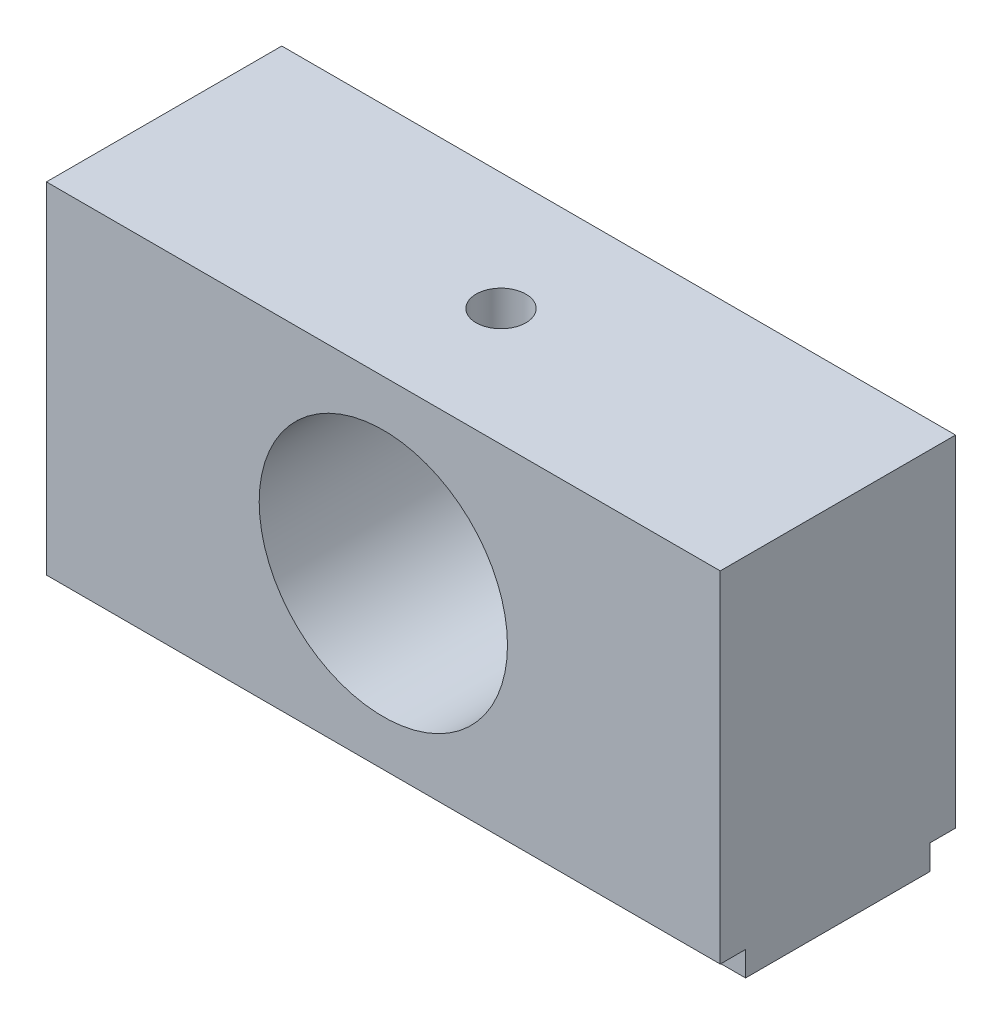
ISO-10303-21;
HEADER;
FILE_DESCRIPTION(('STEP AP214'),'2;1');
FILE_NAME('part.step','',(''),(''),'','','');
FILE_SCHEMA(('AUTOMOTIVE_DESIGN { 1 0 10303 214 1 1 1 1 }'));
ENDSEC;
DATA;
#1=APPLICATION_CONTEXT('core data for automotive mechanical design processes');
#2=APPLICATION_PROTOCOL_DEFINITION('international standard','automotive_design',2000,#1);
#3=PRODUCT_CONTEXT('',#1,'mechanical');
#4=PRODUCT('Part','Part','',(#3));
#5=PRODUCT_RELATED_PRODUCT_CATEGORY('part','',(#4));
#6=PRODUCT_DEFINITION_FORMATION('','',#4);
#7=PRODUCT_DEFINITION_CONTEXT('part definition',#1,'design');
#8=PRODUCT_DEFINITION('design','',#6,#7);
#9=PRODUCT_DEFINITION_SHAPE('','',#8);
#10=(LENGTH_UNIT() NAMED_UNIT(*) SI_UNIT(.MILLI.,.METRE.));
#11=(NAMED_UNIT(*) PLANE_ANGLE_UNIT() SI_UNIT($,.RADIAN.));
#12=(NAMED_UNIT(*) SI_UNIT($,.STERADIAN.) SOLID_ANGLE_UNIT());
#13=UNCERTAINTY_MEASURE_WITH_UNIT(LENGTH_MEASURE(1.E-05),#10,'distance_accuracy_value','');
#14=(GEOMETRIC_REPRESENTATION_CONTEXT(3) GLOBAL_UNCERTAINTY_ASSIGNED_CONTEXT((#13)) GLOBAL_UNIT_ASSIGNED_CONTEXT((#10,
#11,#12)) REPRESENTATION_CONTEXT('',''));
#15=CARTESIAN_POINT('',(0.,0.,0.));
#16=DIRECTION('',(0.,0.,1.));
#17=DIRECTION('',(1.,0.,0.));
#18=AXIS2_PLACEMENT_3D('',#15,#16,#17);
#19=CARTESIAN_POINT('',(-16.1377397473881,-9.63260434534019,24.13));
#20=DIRECTION('',(0.,0.,1.));
#21=DIRECTION('',(1.,0.,0.));
#22=AXIS2_PLACEMENT_3D('',#19,#20,#21);
#23=PLANE('',#22);
#24=DIRECTION('',(0.,-1.,0.));
#25=VECTOR('',#24,1.);
#26=CARTESIAN_POINT('',(-16.1377397473881,27.8173956546598,24.13));
#27=LINE('',#26,#25);
#28=CARTESIAN_POINT('',(-16.1377397473881,27.8173956546598,24.13));
#29=VERTEX_POINT('',#28);
#30=CARTESIAN_POINT('',(-16.1377397473881,-7.09879679924053,24.13));
#31=VERTEX_POINT('',#30);
#32=EDGE_CURVE('E106',#29,#31,#27,.T.);
#33=ORIENTED_EDGE('',*,*,#32,.T.);
#34=DIRECTION('',(1.,0.,0.));
#35=VECTOR('',#34,1.);
#36=CARTESIAN_POINT('',(-16.1377397473881,-7.09879679924053,24.13));
#37=LINE('',#36,#35);
#38=CARTESIAN_POINT('',(52.9502602526119,-7.09879679924053,24.13));
#39=VERTEX_POINT('',#38);
#40=EDGE_CURVE('E66',#31,#39,#37,.T.);
#41=ORIENTED_EDGE('',*,*,#40,.T.);
#42=DIRECTION('',(0.,1.,0.));
#43=VECTOR('',#42,1.);
#44=CARTESIAN_POINT('',(52.9502602526119,27.8173956546598,24.13));
#45=LINE('',#44,#43);
#46=CARTESIAN_POINT('',(52.9502602526119,27.8173956546598,24.13));
#47=VERTEX_POINT('',#46);
#48=EDGE_CURVE('E165',#39,#47,#45,.T.);
#49=ORIENTED_EDGE('',*,*,#48,.T.);
#50=DIRECTION('',(-1.,0.,0.));
#51=VECTOR('',#50,1.);
#52=CARTESIAN_POINT('',(-16.1377397473881,27.8173956546598,24.13));
#53=LINE('',#52,#51);
#54=EDGE_CURVE('E82',#47,#29,#53,.T.);
#55=ORIENTED_EDGE('',*,*,#54,.T.);
#56=EDGE_LOOP('',(#33,#41,#49,#55));
#57=FACE_BOUND('',#56,.T.);
#58=CARTESIAN_POINT('',(18.4062602526119,10.3173956546598,24.13));
#59=DIRECTION('',(0.,0.,1.));
#60=DIRECTION('',(1.,0.,0.));
#61=AXIS2_PLACEMENT_3D('',#58,#59,#60);
#62=CIRCLE('',#61,12.72999994);
#63=CARTESIAN_POINT('',(31.1362601926119,10.3173956546598,24.13));
#64=VERTEX_POINT('',#63);
#65=EDGE_CURVE('E250',#64,#64,#62,.F.);
#66=ORIENTED_EDGE('',*,*,#65,.T.);
#67=EDGE_LOOP('',(#66));
#68=FACE_BOUND('',#67,.T.);
#69=ADVANCED_FACE('F51',(#57,#68),#23,.T.);
#70=CARTESIAN_POINT('',(-16.1377397473881,-9.63260434534019,0.));
#71=DIRECTION('',(0.,0.,1.));
#72=DIRECTION('',(1.,0.,0.));
#73=AXIS2_PLACEMENT_3D('',#70,#71,#72);
#74=PLANE('',#73);
#75=DIRECTION('',(1.,0.,0.));
#76=VECTOR('',#75,1.);
#77=CARTESIAN_POINT('',(-16.1377397473881,-7.08960434534017,0.));
#78=LINE('',#77,#76);
#79=CARTESIAN_POINT('',(-16.1377397473881,-7.08960434534017,0.));
#80=VERTEX_POINT('',#79);
#81=CARTESIAN_POINT('',(52.9502602526119,-7.08960434534017,0.));
#82=VERTEX_POINT('',#81);
#83=EDGE_CURVE('E121',#80,#82,#78,.T.);
#84=ORIENTED_EDGE('',*,*,#83,.F.);
#85=DIRECTION('',(0.,-1.,0.));
#86=VECTOR('',#85,1.);
#87=CARTESIAN_POINT('',(-16.1377397473881,27.8173956546598,0.));
#88=LINE('',#87,#86);
#89=CARTESIAN_POINT('',(-16.1377397473881,27.8173956546598,0.));
#90=VERTEX_POINT('',#89);
#91=EDGE_CURVE('E114',#90,#80,#88,.T.);
#92=ORIENTED_EDGE('',*,*,#91,.F.);
#93=DIRECTION('',(-1.,0.,0.));
#94=VECTOR('',#93,1.);
#95=CARTESIAN_POINT('',(-16.1377397473881,27.8173956546598,0.));
#96=LINE('',#95,#94);
#97=CARTESIAN_POINT('',(52.9502602526119,27.8173956546598,0.));
#98=VERTEX_POINT('',#97);
#99=EDGE_CURVE('E95',#98,#90,#96,.T.);
#100=ORIENTED_EDGE('',*,*,#99,.F.);
#101=DIRECTION('',(0.,1.,0.));
#102=VECTOR('',#101,1.);
#103=CARTESIAN_POINT('',(52.9502602526119,27.8173956546598,0.));
#104=LINE('',#103,#102);
#105=EDGE_CURVE('E107',#82,#98,#104,.T.);
#106=ORIENTED_EDGE('',*,*,#105,.F.);
#107=EDGE_LOOP('',(#84,#92,#100,#106));
#108=FACE_BOUND('',#107,.T.);
#109=CARTESIAN_POINT('',(18.4062602526119,10.3173956546598,0.));
#110=DIRECTION('',(0.,0.,1.));
#111=DIRECTION('',(1.,0.,0.));
#112=AXIS2_PLACEMENT_3D('',#109,#110,#111);
#113=CIRCLE('',#112,9.7);
#114=CARTESIAN_POINT('',(28.1062602526119,10.3173956546598,0.));
#115=VERTEX_POINT('',#114);
#116=EDGE_CURVE('E254',#115,#115,#113,.T.);
#117=ORIENTED_EDGE('',*,*,#116,.T.);
#118=EDGE_LOOP('',(#117));
#119=FACE_BOUND('',#118,.T.);
#120=ADVANCED_FACE('F118',(#108,#119),#74,.F.);
#121=CARTESIAN_POINT('',(-16.1377397473881,27.8173956546598,24.13));
#122=DIRECTION('',(1.,0.,0.));
#123=DIRECTION('',(0.,1.,0.));
#124=AXIS2_PLACEMENT_3D('',#121,#122,#123);
#125=PLANE('',#124);
#126=DIRECTION('',(0.,0.000761971775054119,-0.999999709699465));
#127=VECTOR('',#126,1.);
#128=CARTESIAN_POINT('',(-16.1377397473881,-7.09877652686477,24.1033948545813));
#129=LINE('',#128,#127);
#130=CARTESIAN_POINT('',(-16.1377397473881,-7.0968193180449,21.534784945702));
#131=VERTEX_POINT('',#130);
#132=EDGE_CURVE('E219',#31,#131,#129,.T.);
#133=ORIENTED_EDGE('',*,*,#132,.F.);
#134=ORIENTED_EDGE('',*,*,#32,.F.);
#135=DIRECTION('',(0.,0.,-1.));
#136=VECTOR('',#135,1.);
#137=CARTESIAN_POINT('',(-16.1377397473881,27.8173956546598,24.13));
#138=LINE('',#137,#136);
#139=EDGE_CURVE('E98',#29,#90,#138,.T.);
#140=ORIENTED_EDGE('',*,*,#139,.T.);
#141=ORIENTED_EDGE('',*,*,#91,.T.);
#142=DIRECTION('',(0.,0.,-1.));
#143=VECTOR('',#142,1.);
#144=CARTESIAN_POINT('',(-16.1377397473881,-7.0896043453402,24.13));
#145=LINE('',#144,#143);
#146=CARTESIAN_POINT('',(-16.1377397473881,-7.08960434534017,2.59714999999999));
#147=VERTEX_POINT('',#146);
#148=EDGE_CURVE('E207',#147,#80,#145,.T.);
#149=ORIENTED_EDGE('',*,*,#148,.F.);
#150=DIRECTION('',(0.,-1.,0.));
#151=VECTOR('',#150,1.);
#152=CARTESIAN_POINT('',(-16.1377397473881,27.8173956546598,2.59714999999999));
#153=LINE('',#152,#151);
#154=CARTESIAN_POINT('',(-16.1377397473881,-9.63260434534019,2.59714999999999));
#155=VERTEX_POINT('',#154);
#156=EDGE_CURVE('E123',#147,#155,#153,.T.);
#157=ORIENTED_EDGE('',*,*,#156,.T.);
#158=DIRECTION('',(0.,0.,-1.));
#159=VECTOR('',#158,1.);
#160=CARTESIAN_POINT('',(-16.1377397473881,-9.63260434534019,24.13));
#161=LINE('',#160,#159);
#162=CARTESIAN_POINT('',(-16.1377397473881,-9.63260434534019,21.53285));
#163=VERTEX_POINT('',#162);
#164=EDGE_CURVE('E141',#163,#155,#161,.T.);
#165=ORIENTED_EDGE('',*,*,#164,.F.);
#166=DIRECTION('',(0.,1.,0.));
#167=VECTOR('',#166,1.);
#168=CARTESIAN_POINT('',(-16.1377397473881,27.8173956546598,21.53285));
#169=LINE('',#168,#167);
#170=CARTESIAN_POINT('',(-16.1377397473881,-7.21960434534019,21.53285));
#171=VERTEX_POINT('',#170);
#172=EDGE_CURVE('E187',#163,#171,#169,.T.);
#173=ORIENTED_EDGE('',*,*,#172,.T.);
#174=DIRECTION('',(0.,0.,1.));
#175=VECTOR('',#174,1.);
#176=CARTESIAN_POINT('',(-16.1377397473881,-7.21960434534019,24.13));
#177=LINE('',#176,#175);
#178=CARTESIAN_POINT('',(-16.1377397473881,-7.21960434534019,21.5346913869497));
#179=VERTEX_POINT('',#178);
#180=EDGE_CURVE('E195',#171,#179,#177,.T.);
#181=ORIENTED_EDGE('',*,*,#180,.T.);
#182=DIRECTION('',(0.,-0.999999709699465,-0.000761971775054462));
#183=VECTOR('',#182,1.);
#184=CARTESIAN_POINT('',(-16.1377397473881,27.8193528634797,21.5613900911208));
#185=LINE('',#184,#183);
#186=EDGE_CURVE('E73',#131,#179,#185,.T.);
#187=ORIENTED_EDGE('',*,*,#186,.F.);
#188=EDGE_LOOP('',(#133,#134,#140,#141,#149,#157,#165,#173,#181,#187));
#189=FACE_BOUND('',#188,.T.);
#190=ADVANCED_FACE('F53',(#189),#125,.F.);
#191=CARTESIAN_POINT('',(52.9502602526119,27.8173956546598,24.13));
#192=DIRECTION('',(-1.,0.,0.));
#193=DIRECTION('',(0.,0.,1.));
#194=AXIS2_PLACEMENT_3D('',#191,#192,#193);
#195=PLANE('',#194);
#196=DIRECTION('',(0.,-0.000761971775054119,0.999999709699465));
#197=VECTOR('',#196,1.);
#198=CARTESIAN_POINT('',(52.9502602526119,-7.09877652686475,24.1033948545813));
#199=LINE('',#198,#197);
#200=CARTESIAN_POINT('',(52.9502602526119,-7.0968193180449,21.534784945702));
#201=VERTEX_POINT('',#200);
#202=EDGE_CURVE('E177',#201,#39,#199,.T.);
#203=ORIENTED_EDGE('',*,*,#202,.F.);
#204=DIRECTION('',(0.,0.999999709699465,0.000761971775054462));
#205=VECTOR('',#204,1.);
#206=CARTESIAN_POINT('',(52.9502602526119,27.8193528634797,21.5613900911208));
#207=LINE('',#206,#205);
#208=CARTESIAN_POINT('',(52.9502602526119,-7.21960434534019,21.5346913869497));
#209=VERTEX_POINT('',#208);
#210=EDGE_CURVE('E226',#209,#201,#207,.T.);
#211=ORIENTED_EDGE('',*,*,#210,.F.);
#212=DIRECTION('',(0.,0.,-1.));
#213=VECTOR('',#212,1.);
#214=CARTESIAN_POINT('',(52.9502602526119,-7.21960434534019,24.13));
#215=LINE('',#214,#213);
#216=CARTESIAN_POINT('',(52.9502602526119,-7.21960434534019,21.53285));
#217=VERTEX_POINT('',#216);
#218=EDGE_CURVE('E199',#209,#217,#215,.T.);
#219=ORIENTED_EDGE('',*,*,#218,.T.);
#220=DIRECTION('',(0.,-1.,0.));
#221=VECTOR('',#220,1.);
#222=CARTESIAN_POINT('',(52.9502602526119,27.8173956546598,21.53285));
#223=LINE('',#222,#221);
#224=CARTESIAN_POINT('',(52.9502602526119,-9.63260434534019,21.53285));
#225=VERTEX_POINT('',#224);
#226=EDGE_CURVE('E145',#217,#225,#223,.T.);
#227=ORIENTED_EDGE('',*,*,#226,.T.);
#228=DIRECTION('',(0.,0.,-1.));
#229=VECTOR('',#228,1.);
#230=CARTESIAN_POINT('',(52.9502602526119,-9.63260434534019,24.13));
#231=LINE('',#230,#229);
#232=CARTESIAN_POINT('',(52.9502602526119,-9.63260434534019,2.59714999999999));
#233=VERTEX_POINT('',#232);
#234=EDGE_CURVE('E137',#225,#233,#231,.T.);
#235=ORIENTED_EDGE('',*,*,#234,.T.);
#236=DIRECTION('',(0.,1.,0.));
#237=VECTOR('',#236,1.);
#238=CARTESIAN_POINT('',(52.9502602526119,27.8173956546598,2.59714999999999));
#239=LINE('',#238,#237);
#240=CARTESIAN_POINT('',(52.9502602526119,-7.08960434534017,2.59714999999999));
#241=VERTEX_POINT('',#240);
#242=EDGE_CURVE('E149',#233,#241,#239,.T.);
#243=ORIENTED_EDGE('',*,*,#242,.T.);
#244=DIRECTION('',(0.,0.,1.));
#245=VECTOR('',#244,1.);
#246=CARTESIAN_POINT('',(52.9502602526119,-7.08960434534017,24.13));
#247=LINE('',#246,#245);
#248=EDGE_CURVE('E211',#82,#241,#247,.T.);
#249=ORIENTED_EDGE('',*,*,#248,.F.);
#250=ORIENTED_EDGE('',*,*,#105,.T.);
#251=DIRECTION('',(0.,0.,-1.));
#252=VECTOR('',#251,1.);
#253=CARTESIAN_POINT('',(52.9502602526119,27.8173956546598,24.13));
#254=LINE('',#253,#252);
#255=EDGE_CURVE('E101',#47,#98,#254,.T.);
#256=ORIENTED_EDGE('',*,*,#255,.F.);
#257=ORIENTED_EDGE('',*,*,#48,.F.);
#258=EDGE_LOOP('',(#203,#211,#219,#227,#235,#243,#249,#250,#256,#257));
#259=FACE_BOUND('',#258,.T.);
#260=ADVANCED_FACE('F174',(#259),#195,.F.);
#261=CARTESIAN_POINT('',(67.1742602526119,-7.21960434534019,21.53285));
#262=DIRECTION('',(0.,1.,0.));
#263=DIRECTION('',(-1.,0.,0.));
#264=AXIS2_PLACEMENT_3D('',#261,#262,#263);
#265=PLANE('',#264);
#266=DIRECTION('',(1.,0.,0.));
#267=VECTOR('',#266,1.);
#268=CARTESIAN_POINT('',(67.1742602526119,-7.21960434534019,21.5346913869497));
#269=LINE('',#268,#267);
#270=EDGE_CURVE('E155',#179,#209,#269,.T.);
#271=ORIENTED_EDGE('',*,*,#270,.F.);
#272=ORIENTED_EDGE('',*,*,#180,.F.);
#273=DIRECTION('',(-1.,0.,0.));
#274=VECTOR('',#273,1.);
#275=CARTESIAN_POINT('',(67.1742602526119,-7.21960434534019,21.53285));
#276=LINE('',#275,#274);
#277=EDGE_CURVE('E203',#217,#171,#276,.T.);
#278=ORIENTED_EDGE('',*,*,#277,.F.);
#279=ORIENTED_EDGE('',*,*,#218,.F.);
#280=EDGE_LOOP('',(#271,#272,#278,#279));
#281=FACE_BOUND('',#280,.T.);
#282=ADVANCED_FACE('F290',(#281),#265,.F.);
#283=CARTESIAN_POINT('',(-16.1377397473881,-9.63260434534019,24.13));
#284=DIRECTION('',(0.,1.,0.));
#285=DIRECTION('',(0.,0.,1.));
#286=AXIS2_PLACEMENT_3D('',#283,#284,#285);
#287=PLANE('',#286);
#288=CARTESIAN_POINT('',(-3.18373974738811,-9.63260434534019,12.065));
#289=DIRECTION('',(0.,-1.,0.));
#290=DIRECTION('',(0.,0.,-1.));
#291=AXIS2_PLACEMENT_3D('',#288,#289,#290);
#292=CIRCLE('',#291,3.4544);
#293=CARTESIAN_POINT('',(-3.18373974738811,-9.63260434534019,8.6106));
#294=VERTEX_POINT('',#293);
#295=EDGE_CURVE('E242',#294,#294,#292,.T.);
#296=ORIENTED_EDGE('',*,*,#295,.F.);
#297=EDGE_LOOP('',(#296));
#298=FACE_BOUND('',#297,.T.);
#299=CARTESIAN_POINT('',(39.9962602526119,-9.63260434534019,12.065));
#300=DIRECTION('',(0.,-1.,0.));
#301=DIRECTION('',(0.,0.,-1.));
#302=AXIS2_PLACEMENT_3D('',#299,#300,#301);
#303=CIRCLE('',#302,3.4544);
#304=CARTESIAN_POINT('',(39.9962602526119,-9.63260434534019,8.6106));
#305=VERTEX_POINT('',#304);
#306=EDGE_CURVE('E234',#305,#305,#303,.T.);
#307=ORIENTED_EDGE('',*,*,#306,.F.);
#308=EDGE_LOOP('',(#307));
#309=FACE_BOUND('',#308,.T.);
#310=ORIENTED_EDGE('',*,*,#164,.T.);
#311=DIRECTION('',(1.,0.,0.));
#312=VECTOR('',#311,1.);
#313=CARTESIAN_POINT('',(-16.1377397473881,-9.63260434534019,2.59714999999999));
#314=LINE('',#313,#312);
#315=EDGE_CURVE('E130',#155,#233,#314,.T.);
#316=ORIENTED_EDGE('',*,*,#315,.T.);
#317=ORIENTED_EDGE('',*,*,#234,.F.);
#318=DIRECTION('',(-1.,0.,0.));
#319=VECTOR('',#318,1.);
#320=CARTESIAN_POINT('',(-16.1377397473881,-9.63260434534019,21.53285));
#321=LINE('',#320,#319);
#322=EDGE_CURVE('E191',#225,#163,#321,.T.);
#323=ORIENTED_EDGE('',*,*,#322,.T.);
#324=EDGE_LOOP('',(#310,#316,#317,#323));
#325=FACE_BOUND('',#324,.T.);
#326=ADVANCED_FACE('F296',(#298,#309,#325),#287,.F.);
#327=CARTESIAN_POINT('',(-16.1377397473881,27.8173956546598,24.13));
#328=DIRECTION('',(0.,-1.,0.));
#329=DIRECTION('',(0.,0.,-1.));
#330=AXIS2_PLACEMENT_3D('',#327,#328,#329);
#331=PLANE('',#330);
#332=CARTESIAN_POINT('',(18.4062602526119,27.8173956546598,12.065));
#333=DIRECTION('',(0.,1.,0.));
#334=DIRECTION('',(0.,0.,1.));
#335=AXIS2_PLACEMENT_3D('',#332,#333,#334);
#336=CIRCLE('',#335,2.55269999999999);
#337=CARTESIAN_POINT('',(18.4062602526119,27.8173956546598,14.6177));
#338=VERTEX_POINT('',#337);
#339=EDGE_CURVE('E262',#338,#338,#336,.T.);
#340=ORIENTED_EDGE('',*,*,#339,.F.);
#341=EDGE_LOOP('',(#340));
#342=FACE_BOUND('',#341,.T.);
#343=ORIENTED_EDGE('',*,*,#99,.T.);
#344=ORIENTED_EDGE('',*,*,#139,.F.);
#345=ORIENTED_EDGE('',*,*,#54,.F.);
#346=ORIENTED_EDGE('',*,*,#255,.T.);
#347=EDGE_LOOP('',(#343,#344,#345,#346));
#348=FACE_BOUND('',#347,.T.);
#349=ADVANCED_FACE('F97',(#342,#348),#331,.F.);
#350=CARTESIAN_POINT('',(67.1742602526119,-7.21960434534016,2.59714999999999));
#351=DIRECTION('',(0.,0.,1.));
#352=DIRECTION('',(0.,-1.,0.));
#353=AXIS2_PLACEMENT_3D('',#350,#351,#352);
#354=PLANE('',#353);
#355=ORIENTED_EDGE('',*,*,#156,.F.);
#356=DIRECTION('',(1.,0.,0.));
#357=VECTOR('',#356,1.);
#358=CARTESIAN_POINT('',(-41.5377397473881,-7.0896043453402,2.59714999999999));
#359=LINE('',#358,#357);
#360=EDGE_CURVE('E215',#147,#241,#359,.T.);
#361=ORIENTED_EDGE('',*,*,#360,.T.);
#362=ORIENTED_EDGE('',*,*,#242,.F.);
#363=ORIENTED_EDGE('',*,*,#315,.F.);
#364=EDGE_LOOP('',(#355,#361,#362,#363));
#365=FACE_BOUND('',#364,.T.);
#366=ADVANCED_FACE('F295',(#365),#354,.F.);
#367=CARTESIAN_POINT('',(67.1742602526119,-10.3700800571753,21.53285));
#368=DIRECTION('',(0.,0.,-1.));
#369=DIRECTION('',(-1.,0.,0.));
#370=AXIS2_PLACEMENT_3D('',#367,#368,#369);
#371=PLANE('',#370);
#372=ORIENTED_EDGE('',*,*,#322,.F.);
#373=ORIENTED_EDGE('',*,*,#226,.F.);
#374=ORIENTED_EDGE('',*,*,#277,.T.);
#375=ORIENTED_EDGE('',*,*,#172,.F.);
#376=EDGE_LOOP('',(#372,#373,#374,#375));
#377=FACE_BOUND('',#376,.T.);
#378=ADVANCED_FACE('F376',(#377),#371,.F.);
#379=CARTESIAN_POINT('',(-41.5377397473881,-7.0896043453402,-4.95940193624805));
#380=DIRECTION('',(0.,-1.,0.));
#381=DIRECTION('',(1.,0.,0.));
#382=AXIS2_PLACEMENT_3D('',#379,#380,#381);
#383=PLANE('',#382);
#384=ORIENTED_EDGE('',*,*,#148,.T.);
#385=ORIENTED_EDGE('',*,*,#83,.T.);
#386=ORIENTED_EDGE('',*,*,#248,.T.);
#387=ORIENTED_EDGE('',*,*,#360,.F.);
#388=EDGE_LOOP('',(#384,#385,#386,#387));
#389=FACE_BOUND('',#388,.T.);
#390=ADVANCED_FACE('F373',(#389),#383,.T.);
#391=CARTESIAN_POINT('',(-41.5377397473881,-7.10257719733706,29.091334688279));
#392=DIRECTION('',(0.,-0.999999709699465,-0.000761971775054119));
#393=DIRECTION('',(0.,0.000761971775054119,-0.999999709699465));
#394=AXIS2_PLACEMENT_3D('',#391,#392,#393);
#395=PLANE('',#394);
#396=ORIENTED_EDGE('',*,*,#132,.T.);
#397=DIRECTION('',(1.,0.,0.));
#398=VECTOR('',#397,1.);
#399=CARTESIAN_POINT('',(-41.5377397473881,-7.0968193180449,21.534784945702));
#400=LINE('',#399,#398);
#401=EDGE_CURVE('E230',#131,#201,#400,.T.);
#402=ORIENTED_EDGE('',*,*,#401,.T.);
#403=ORIENTED_EDGE('',*,*,#202,.T.);
#404=ORIENTED_EDGE('',*,*,#40,.F.);
#405=EDGE_LOOP('',(#396,#402,#403,#404));
#406=FACE_BOUND('',#405,.T.);
#407=ADVANCED_FACE('F370',(#406),#395,.T.);
#408=CARTESIAN_POINT('',(-41.5377397473881,-7.0968193180449,21.534784945702));
#409=DIRECTION('',(0.,-0.000761971775054462,0.999999709699465));
#410=DIRECTION('',(0.,-0.999999709699465,-0.000761971775054462));
#411=AXIS2_PLACEMENT_3D('',#408,#409,#410);
#412=PLANE('',#411);
#413=ORIENTED_EDGE('',*,*,#186,.T.);
#414=ORIENTED_EDGE('',*,*,#270,.T.);
#415=ORIENTED_EDGE('',*,*,#210,.T.);
#416=ORIENTED_EDGE('',*,*,#401,.F.);
#417=EDGE_LOOP('',(#413,#414,#415,#416));
#418=FACE_BOUND('',#417,.T.);
#419=ADVANCED_FACE('F366',(#418),#412,.T.);
#420=CARTESIAN_POINT('',(39.9962602526119,-9.63260434534019,12.065));
#421=DIRECTION('',(0.,-1.,0.));
#422=DIRECTION('',(0.,0.,-1.));
#423=AXIS2_PLACEMENT_3D('',#420,#421,#422);
#424=CYLINDRICAL_SURFACE('',#423,3.4544);
#425=CARTESIAN_POINT('',(39.9962602526119,9.41993565465982,12.065));
#426=DIRECTION('',(0.,-1.,0.));
#427=DIRECTION('',(0.,0.,-1.));
#428=AXIS2_PLACEMENT_3D('',#425,#426,#427);
#429=CIRCLE('',#428,3.4544);
#430=CARTESIAN_POINT('',(39.9962602526119,9.41993565465982,8.6106));
#431=VERTEX_POINT('',#430);
#432=EDGE_CURVE('E238',#431,#431,#429,.T.);
#433=ORIENTED_EDGE('',*,*,#432,.F.);
#434=EDGE_LOOP('',(#433));
#435=FACE_BOUND('',#434,.T.);
#436=ORIENTED_EDGE('',*,*,#306,.T.);
#437=EDGE_LOOP('',(#436));
#438=FACE_BOUND('',#437,.T.);
#439=ADVANCED_FACE('F360',(#435,#438),#424,.F.);
#440=CARTESIAN_POINT('',(39.9962602526119,9.41993565465982,12.065));
#441=DIRECTION('',(0.,-1.,0.));
#442=DIRECTION('',(0.,0.,-1.));
#443=AXIS2_PLACEMENT_3D('',#440,#441,#442);
#444=CONICAL_SURFACE('',#443,3.4544,1.02974425867665);
#445=CARTESIAN_POINT('',(39.9962602526119,11.4955485770286,12.065));
#446=VERTEX_POINT('',#445);
#447=VERTEX_LOOP('',#446);
#448=FACE_BOUND('',#447,.T.);
#449=ORIENTED_EDGE('',*,*,#432,.T.);
#450=EDGE_LOOP('',(#449));
#451=FACE_BOUND('',#450,.T.);
#452=ADVANCED_FACE('F355',(#448,#451),#444,.F.);
#453=CARTESIAN_POINT('',(-3.18373974738811,-9.63260434534019,12.065));
#454=DIRECTION('',(0.,-1.,0.));
#455=DIRECTION('',(0.,0.,-1.));
#456=AXIS2_PLACEMENT_3D('',#453,#454,#455);
#457=CYLINDRICAL_SURFACE('',#456,3.4544);
#458=CARTESIAN_POINT('',(-3.18373974738811,9.41993565465982,12.065));
#459=DIRECTION('',(0.,-1.,0.));
#460=DIRECTION('',(0.,0.,-1.));
#461=AXIS2_PLACEMENT_3D('',#458,#459,#460);
#462=CIRCLE('',#461,3.45439999999999);
#463=CARTESIAN_POINT('',(-3.18373974738811,9.41993565465982,8.6106));
#464=VERTEX_POINT('',#463);
#465=EDGE_CURVE('E246',#464,#464,#462,.T.);
#466=ORIENTED_EDGE('',*,*,#465,.F.);
#467=EDGE_LOOP('',(#466));
#468=FACE_BOUND('',#467,.T.);
#469=ORIENTED_EDGE('',*,*,#295,.T.);
#470=EDGE_LOOP('',(#469));
#471=FACE_BOUND('',#470,.T.);
#472=ADVANCED_FACE('F349',(#468,#471),#457,.F.);
#473=CARTESIAN_POINT('',(-3.18373974738811,9.41993565465982,12.065));
#474=DIRECTION('',(0.,-1.,0.));
#475=DIRECTION('',(0.,0.,-1.));
#476=AXIS2_PLACEMENT_3D('',#473,#474,#475);
#477=CONICAL_SURFACE('',#476,3.45439999999999,1.02974425867665);
#478=CARTESIAN_POINT('',(-3.18373974738813,11.4955485770286,12.065));
#479=VERTEX_POINT('',#478);
#480=VERTEX_LOOP('',#479);
#481=FACE_BOUND('',#480,.T.);
#482=ORIENTED_EDGE('',*,*,#465,.T.);
#483=EDGE_LOOP('',(#482));
#484=FACE_BOUND('',#483,.T.);
#485=ADVANCED_FACE('F279',(#481,#484),#477,.F.);
#486=CARTESIAN_POINT('',(18.4062602526119,10.3173956546598,38.608));
#487=DIRECTION('',(0.,0.,-1.));
#488=DIRECTION('',(-1.,0.,0.));
#489=AXIS2_PLACEMENT_3D('',#486,#487,#488);
#490=CYLINDRICAL_SURFACE('',#489,12.72999994);
#491=CARTESIAN_POINT('',(18.4062602526119,23.0473955946598,14.6177));
#492=CARTESIAN_POINT('',(18.2643969472826,23.0473929791611,14.6176947905879));
#493=CARTESIAN_POINT('',(18.1224678657904,23.0449998724307,14.6058342147047));
#494=CARTESIAN_POINT('',(17.8426219818021,23.0356841357899,14.558743273128));
#495=CARTESIAN_POINT('',(17.7047084486588,23.0287579172202,14.5234943916672));
#496=CARTESIAN_POINT('',(17.4369801768421,23.0111493084213,14.4307599564106));
#497=CARTESIAN_POINT('',(17.3071578004001,23.0004705257015,14.3732957539119));
#498=CARTESIAN_POINT('',(17.0590058201325,22.9765174500559,14.2378254397315));
#499=CARTESIAN_POINT('',(16.9406755429665,22.9632433093337,14.1598205325574));
#500=CARTESIAN_POINT('',(16.7172472984397,22.9353582782778,13.9843575492714));
#501=CARTESIAN_POINT('',(16.6123282776831,22.9207330615969,13.8866738634706));
#502=CARTESIAN_POINT('',(16.4202503440151,22.8918983707587,13.6751111702245));
#503=CARTESIAN_POINT('',(16.3330928232162,22.8776889292638,13.5612308945083));
#504=CARTESIAN_POINT('',(16.1782495539031,22.8511546936589,13.3192195253467));
#505=CARTESIAN_POINT('',(16.1107492357002,22.8388483303171,13.1909675905799));
#506=CARTESIAN_POINT('',(15.9983244341389,22.8177171323972,12.9246549888095));
#507=CARTESIAN_POINT('',(15.9533977080769,22.8088919519796,12.7865952977701));
#508=CARTESIAN_POINT('',(15.8879766062677,22.7958673056098,12.5065119003383));
#509=CARTESIAN_POINT('',(15.8671681921021,22.7916084389721,12.3645643649178));
#510=CARTESIAN_POINT('',(15.8495989303501,22.788019839595,12.0791339341396));
#511=CARTESIAN_POINT('',(15.8528356106103,22.7886896001275,11.9356511981356));
#512=CARTESIAN_POINT('',(15.8830107885926,22.7948286165333,11.6535218903534));
#513=CARTESIAN_POINT('',(15.9095891543411,22.800224944247,11.5148349769336));
#514=CARTESIAN_POINT('',(15.9851247298577,22.8150942210448,11.2439293764722));
#515=CARTESIAN_POINT('',(16.0340830134494,22.8245673657397,11.1117110001381));
#516=CARTESIAN_POINT('',(16.1533321985531,22.846597379571,10.8564584970954));
#517=CARTESIAN_POINT('',(16.2237657277636,22.8591747556501,10.7334928465892));
#518=CARTESIAN_POINT('',(16.3838654287857,22.8859829281561,10.5009908390866));
#519=CARTESIAN_POINT('',(16.4735338220906,22.9002139154767,10.3914560355581));
#520=CARTESIAN_POINT('',(16.6714854976346,22.9290416931618,10.1868470986681));
#521=CARTESIAN_POINT('',(16.7800761170304,22.9436404444444,10.0920703291284));
#522=CARTESIAN_POINT('',(17.0117687404847,22.9713231848228,9.9220302805383));
#523=CARTESIAN_POINT('',(17.1348709325061,22.9844071542937,9.84676725428253));
#524=CARTESIAN_POINT('',(17.3924234759852,23.0076185379784,9.71783562309744));
#525=CARTESIAN_POINT('',(17.5268913598712,23.0177412728846,9.66420114526906));
#526=CARTESIAN_POINT('',(17.8031772885812,23.0338541311797,9.58036687241855));
#527=CARTESIAN_POINT('',(17.9449944360041,23.0398447578581,9.55016422335101));
#528=CARTESIAN_POINT('',(18.2293979881252,23.0469482855356,9.51447225964609));
#529=CARTESIAN_POINT('',(18.3719313803897,23.0481414942766,9.50857601809358));
#530=CARTESIAN_POINT('',(18.655946747411,23.0457388597093,9.52056814639886));
#531=CARTESIAN_POINT('',(18.7974287811439,23.0421432870986,9.53845517184929));
#532=CARTESIAN_POINT('',(19.0740115457613,23.0306173594459,9.59716803534198));
#533=CARTESIAN_POINT('',(19.2091584164755,23.022726501926,9.63778495354357));
#534=CARTESIAN_POINT('',(19.4707232833705,23.0034916295376,9.74057624185148));
#535=CARTESIAN_POINT('',(19.5971406221584,22.9921473549507,9.8027522333836));
#536=CARTESIAN_POINT('',(19.8393731525325,22.9670641028655,9.94777616910591));
#537=CARTESIAN_POINT('',(19.9550388315204,22.9532973898043,10.030868944497));
#538=CARTESIAN_POINT('',(20.1709309926063,22.9249613420204,10.2150400715083));
#539=CARTESIAN_POINT('',(20.2711558078815,22.9103919208765,10.3161203623248));
#540=CARTESIAN_POINT('',(20.4548927815492,22.8818216424475,10.5352500897188));
#541=CARTESIAN_POINT('',(20.5381255152713,22.8678329080497,10.6535356742859));
#542=CARTESIAN_POINT('',(20.6835420230871,22.8422653055958,10.9026477820499));
#543=CARTESIAN_POINT('',(20.745726641664,22.8306863408632,11.0334738018348));
#544=CARTESIAN_POINT('',(20.846900892417,22.8113473306909,11.3032926497601));
#545=CARTESIAN_POINT('',(20.8860111099255,22.8035674688592,11.4422387737216));
#546=CARTESIAN_POINT('',(20.9402917636212,22.7926657121608,11.7249032280985));
#547=CARTESIAN_POINT('',(20.9554653402856,22.7895432062539,11.8686209299583));
#548=CARTESIAN_POINT('',(20.961325285043,22.7883437522223,12.1539431310743));
#549=CARTESIAN_POINT('',(20.9524532323497,22.7901758159422,12.2955383631297));
#550=CARTESIAN_POINT('',(20.9114486821693,22.7984757117434,12.5751741437477));
#551=CARTESIAN_POINT('',(20.8793163737159,22.8049435061506,12.7132147211892));
#552=CARTESIAN_POINT('',(20.7929008615466,22.8217453237169,12.9815398773614));
#553=CARTESIAN_POINT('',(20.7386720807662,22.8320698427176,13.1118426171226));
#554=CARTESIAN_POINT('',(20.6096537846028,22.8554271816486,13.3615691895467));
#555=CARTESIAN_POINT('',(20.5348625335678,22.8684602301799,13.4809921027238));
#556=CARTESIAN_POINT('',(20.3653353147277,22.8960443533707,13.7077672591893));
#557=CARTESIAN_POINT('',(20.2702805636222,22.9106175505081,13.8148785466562));
#558=CARTESIAN_POINT('',(20.0635824012075,22.9394814341444,14.0117762171634));
#559=CARTESIAN_POINT('',(19.9519351824643,22.9537720549461,14.1015586128857));
#560=CARTESIAN_POINT('',(19.7138084117229,22.9806380887369,14.2621430164375));
#561=CARTESIAN_POINT('',(19.5871850482776,22.9931938549773,14.3327351947235));
#562=CARTESIAN_POINT('',(19.3236563044315,23.0149820066552,14.45152724255));
#563=CARTESIAN_POINT('',(19.1867603038015,23.024217380311,14.4997472575398));
#564=CARTESIAN_POINT('',(18.9423445001869,23.0365339680225,14.5631075088357));
#565=CARTESIAN_POINT('',(18.8362142883827,23.0405832038013,14.5835431241548));
#566=CARTESIAN_POINT('',(18.6221554627696,23.0460149695004,14.6108411337377));
#567=CARTESIAN_POINT('',(18.5142269069318,23.0473975852144,14.6177039646812));
#568=CARTESIAN_POINT('',(18.4062602526119,23.0473955946598,14.6177));
#569=B_SPLINE_CURVE_WITH_KNOTS('',3,(#491,#492,#493,#494,#495,#496,#497,#498,#499,#500,#501,
#502,#503,#504,#505,#506,#507,#508,#509,#510,#511,#512,#513,#514,#515,#516,#517,#518,#519,#520,
#521,#522,#523,#524,#525,#526,#527,#528,#529,#530,#531,#532,#533,#534,#535,#536,#537,#538,#539,
#540,#541,#542,#543,#544,#545,#546,#547,#548,#549,#550,#551,#552,#553,#554,#555,#556,#557,#558,
#559,#560,#561,#562,#563,#564,#565,#566,#567,#568),.UNSPECIFIED.,.T.,.F.,(4,2,2,2,2,2,2,2,2,2,2,
2,2,2,2,2,2,2,2,2,2,2,2,2,2,2,2,2,2,2,2,2,2,2,2,2,2,2,4),(0.,0.425194935447678,
0.850726886280312,1.27585086814964,1.70094992628282,2.13123255949733,2.56154890448038,
2.99580196073859,3.43001186509031,3.85850216312563,4.28694840730437,4.70889817240786,
5.130868185448,5.55570411806027,5.98058914271659,6.41315861336628,6.84573368754199,
7.27898866435651,7.71219086152674,8.138110375687,8.56400581472814,8.98604948893409,
9.40812491130322,9.83539126138899,10.2627037020988,10.6965596266472,11.1303981421572,
11.5619488889126,11.9934430116825,12.4170670288531,12.8406876033159,13.2632710599614,
13.6858901972975,14.1157263600976,14.5456613091057,14.9801236977864,15.4141941034175,
15.7378038737478,16.0614032323523),.UNSPECIFIED.);
#570=CARTESIAN_POINT('',(18.4062602526119,23.0473955946598,14.6177));
#571=VERTEX_POINT('',#570);
#572=EDGE_CURVE('E55',#571,#571,#569,.T.);
#573=ORIENTED_EDGE('',*,*,#572,.F.);
#574=EDGE_LOOP('',(#573));
#575=FACE_BOUND('',#574,.T.);
#576=CARTESIAN_POINT('',(18.4062602526119,10.3173956546598,4.73000000000001));
#577=DIRECTION('',(0.,0.,1.));
#578=DIRECTION('',(1.,0.,0.));
#579=AXIS2_PLACEMENT_3D('',#576,#577,#578);
#580=CIRCLE('',#579,12.72999994);
#581=CARTESIAN_POINT('',(31.1362601926119,10.3173956546598,4.73000000000001));
#582=VERTEX_POINT('',#581);
#583=EDGE_CURVE('E11',#582,#582,#580,.T.);
#584=ORIENTED_EDGE('',*,*,#583,.F.);
#585=EDGE_LOOP('',(#584));
#586=FACE_BOUND('',#585,.T.);
#587=ORIENTED_EDGE('',*,*,#65,.F.);
#588=EDGE_LOOP('',(#587));
#589=FACE_BOUND('',#588,.T.);
#590=ADVANCED_FACE('F275',(#575,#586,#589),#490,.F.);
#591=CARTESIAN_POINT('',(18.4062602526119,10.3173956546598,4.73000000000001));
#592=DIRECTION('',(0.,0.,1.));
#593=DIRECTION('',(1.,0.,0.));
#594=AXIS2_PLACEMENT_3D('',#591,#592,#593);
#595=PLANE('',#594);
#596=CARTESIAN_POINT('',(18.4062602526119,10.3173956546598,4.73000000000001));
#597=DIRECTION('',(0.,0.,1.));
#598=DIRECTION('',(1.,0.,0.));
#599=AXIS2_PLACEMENT_3D('',#596,#597,#598);
#600=CIRCLE('',#599,9.7);
#601=CARTESIAN_POINT('',(28.1062602526119,10.3173956546598,4.73000000000001));
#602=VERTEX_POINT('',#601);
#603=EDGE_CURVE('E255',#602,#602,#600,.T.);
#604=ORIENTED_EDGE('',*,*,#603,.F.);
#605=EDGE_LOOP('',(#604));
#606=FACE_BOUND('',#605,.T.);
#607=ORIENTED_EDGE('',*,*,#583,.T.);
#608=EDGE_LOOP('',(#607));
#609=FACE_BOUND('',#608,.T.);
#610=ADVANCED_FACE('F278',(#606,#609),#595,.T.);
#611=CARTESIAN_POINT('',(18.4062602526119,10.3173956546598,0.));
#612=DIRECTION('',(0.,0.,1.));
#613=DIRECTION('',(1.,0.,0.));
#614=AXIS2_PLACEMENT_3D('',#611,#612,#613);
#615=CYLINDRICAL_SURFACE('',#614,9.7);
#616=ORIENTED_EDGE('',*,*,#116,.F.);
#617=EDGE_LOOP('',(#616));
#618=FACE_BOUND('',#617,.T.);
#619=ORIENTED_EDGE('',*,*,#603,.T.);
#620=EDGE_LOOP('',(#619));
#621=FACE_BOUND('',#620,.T.);
#622=ADVANCED_FACE('F435',(#618,#621),#615,.F.);
#623=CARTESIAN_POINT('',(18.4062602526119,27.8173956546598,12.065));
#624=DIRECTION('',(0.,1.,0.));
#625=DIRECTION('',(0.,0.,1.));
#626=AXIS2_PLACEMENT_3D('',#623,#624,#625);
#627=CYLINDRICAL_SURFACE('',#626,2.55269999999999);
#628=ORIENTED_EDGE('',*,*,#572,.T.);
#629=EDGE_LOOP('',(#628));
#630=FACE_BOUND('',#629,.T.);
#631=ORIENTED_EDGE('',*,*,#339,.T.);
#632=EDGE_LOOP('',(#631));
#633=FACE_BOUND('',#632,.T.);
#634=ADVANCED_FACE('F273',(#630,#633),#627,.F.);
#635=CLOSED_SHELL('',(#69,#120,#190,#260,#282,#326,#349,#366,#378,#390,#407,#419,#439,#452,#472,
#485,#590,#610,#622,#634));
#636=MANIFOLD_SOLID_BREP('B2',#635);
#637=ADVANCED_BREP_SHAPE_REPRESENTATION('',(#18,#636),#14);
#638=SHAPE_DEFINITION_REPRESENTATION(#9,#637);
ENDSEC;
END-ISO-10303-21;
